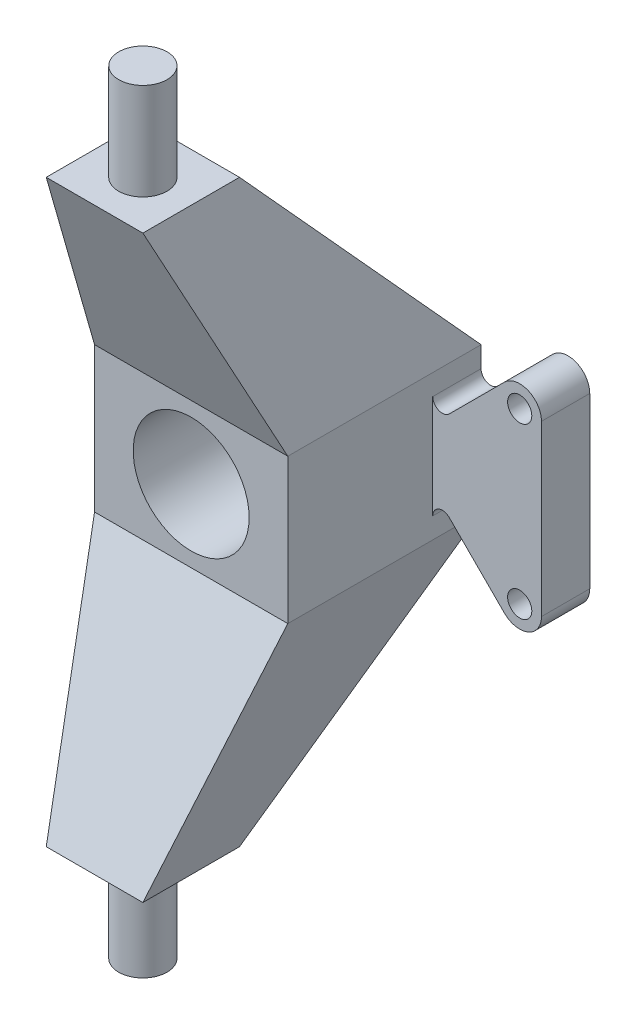
ISO-10303-21;
HEADER;
FILE_DESCRIPTION(('STEP AP214'),'2;1');
FILE_NAME('part.step','',(''),(''),'','','');
FILE_SCHEMA(('AUTOMOTIVE_DESIGN { 1 0 10303 214 1 1 1 1 }'));
ENDSEC;
DATA;
#1=APPLICATION_CONTEXT('core data for automotive mechanical design processes');
#2=APPLICATION_PROTOCOL_DEFINITION('international standard','automotive_design',2000,#1);
#3=PRODUCT_CONTEXT('',#1,'mechanical');
#4=PRODUCT('Part','Part','',(#3));
#5=PRODUCT_RELATED_PRODUCT_CATEGORY('part','',(#4));
#6=PRODUCT_DEFINITION_FORMATION('','',#4);
#7=PRODUCT_DEFINITION_CONTEXT('part definition',#1,'design');
#8=PRODUCT_DEFINITION('design','',#6,#7);
#9=PRODUCT_DEFINITION_SHAPE('','',#8);
#10=(LENGTH_UNIT() NAMED_UNIT(*) SI_UNIT(.MILLI.,.METRE.));
#11=(NAMED_UNIT(*) PLANE_ANGLE_UNIT() SI_UNIT($,.RADIAN.));
#12=(NAMED_UNIT(*) SI_UNIT($,.STERADIAN.) SOLID_ANGLE_UNIT());
#13=UNCERTAINTY_MEASURE_WITH_UNIT(LENGTH_MEASURE(1.E-05),#10,'distance_accuracy_value','');
#14=(GEOMETRIC_REPRESENTATION_CONTEXT(3) GLOBAL_UNCERTAINTY_ASSIGNED_CONTEXT((#13)) GLOBAL_UNIT_ASSIGNED_CONTEXT((#10,
#11,#12)) REPRESENTATION_CONTEXT('',''));
#15=CARTESIAN_POINT('',(0.,0.,0.));
#16=DIRECTION('',(0.,0.,1.));
#17=DIRECTION('',(1.,0.,0.));
#18=AXIS2_PLACEMENT_3D('',#15,#16,#17);
#19=CARTESIAN_POINT('',(-20.,15.,-40.));
#20=DIRECTION('',(-1.,0.,0.));
#21=DIRECTION('',(0.,0.,1.));
#22=AXIS2_PLACEMENT_3D('',#19,#20,#21);
#23=PLANE('',#22);
#24=DIRECTION('',(0.,-1.,0.));
#25=VECTOR('',#24,1.);
#26=CARTESIAN_POINT('',(-20.,15.,0.));
#27=LINE('',#26,#25);
#28=CARTESIAN_POINT('',(-20.,15.,0.));
#29=VERTEX_POINT('',#28);
#30=CARTESIAN_POINT('',(-20.,-15.,0.));
#31=VERTEX_POINT('',#30);
#32=EDGE_CURVE('E443',#29,#31,#27,.T.);
#33=ORIENTED_EDGE('',*,*,#32,.F.);
#34=DIRECTION('',(0.,0.,1.));
#35=VECTOR('',#34,1.);
#36=CARTESIAN_POINT('',(-20.,15.,0.));
#37=LINE('',#36,#35);
#38=CARTESIAN_POINT('',(-20.,15.,-40.));
#39=VERTEX_POINT('',#38);
#40=EDGE_CURVE('E351',#39,#29,#37,.T.);
#41=ORIENTED_EDGE('',*,*,#40,.F.);
#42=DIRECTION('',(0.,-1.,0.));
#43=VECTOR('',#42,1.);
#44=CARTESIAN_POINT('',(-20.,15.,-40.));
#45=LINE('',#44,#43);
#46=CARTESIAN_POINT('',(-20.,-15.,-40.));
#47=VERTEX_POINT('',#46);
#48=EDGE_CURVE('E453',#39,#47,#45,.T.);
#49=ORIENTED_EDGE('',*,*,#48,.T.);
#50=DIRECTION('',(0.,0.,1.));
#51=VECTOR('',#50,1.);
#52=CARTESIAN_POINT('',(-20.,-15.,0.));
#53=LINE('',#52,#51);
#54=EDGE_CURVE('E238',#47,#31,#53,.T.);
#55=ORIENTED_EDGE('',*,*,#54,.T.);
#56=EDGE_LOOP('',(#33,#41,#49,#55));
#57=FACE_BOUND('',#56,.T.);
#58=ADVANCED_FACE('F50',(#57),#23,.T.);
#59=CARTESIAN_POINT('',(20.,15.,-40.));
#60=DIRECTION('',(1.,0.,0.));
#61=DIRECTION('',(0.,0.,-1.));
#62=AXIS2_PLACEMENT_3D('',#59,#60,#61);
#63=PLANE('',#62);
#64=DIRECTION('',(0.,1.,0.));
#65=VECTOR('',#64,1.);
#66=CARTESIAN_POINT('',(20.,15.,-40.));
#67=LINE('',#66,#65);
#68=CARTESIAN_POINT('',(20.,-15.,-40.));
#69=VERTEX_POINT('',#68);
#70=CARTESIAN_POINT('',(20.,-10.6923881554251,-40.));
#71=VERTEX_POINT('',#70);
#72=EDGE_CURVE('E459',#69,#71,#67,.T.);
#73=ORIENTED_EDGE('',*,*,#72,.T.);
#74=DIRECTION('',(0.,0.,-1.));
#75=VECTOR('',#74,1.);
#76=CARTESIAN_POINT('',(20.,-10.6923881554251,-30.));
#77=LINE('',#76,#75);
#78=CARTESIAN_POINT('',(20.,-10.6923881554251,-30.));
#79=VERTEX_POINT('',#78);
#80=EDGE_CURVE('E492',#71,#79,#77,.F.);
#81=ORIENTED_EDGE('',*,*,#80,.T.);
#82=DIRECTION('',(0.,1.,0.));
#83=VECTOR('',#82,1.);
#84=CARTESIAN_POINT('',(20.,5.863961030679,-30.));
#85=LINE('',#84,#83);
#86=CARTESIAN_POINT('',(20.,10.6923881554252,-30.));
#87=VERTEX_POINT('',#86);
#88=EDGE_CURVE('E65',#79,#87,#85,.T.);
#89=ORIENTED_EDGE('',*,*,#88,.T.);
#90=DIRECTION('',(0.,0.,-1.));
#91=VECTOR('',#90,1.);
#92=CARTESIAN_POINT('',(20.,10.6923881554252,-40.));
#93=LINE('',#92,#91);
#94=CARTESIAN_POINT('',(20.,10.6923881554252,-40.));
#95=VERTEX_POINT('',#94);
#96=EDGE_CURVE('E350',#87,#95,#93,.T.);
#97=ORIENTED_EDGE('',*,*,#96,.T.);
#98=CARTESIAN_POINT('',(20.,15.,-40.));
#99=VERTEX_POINT('',#98);
#100=EDGE_CURVE('E457',#95,#99,#67,.T.);
#101=ORIENTED_EDGE('',*,*,#100,.T.);
#102=DIRECTION('',(0.,0.,-1.));
#103=VECTOR('',#102,1.);
#104=CARTESIAN_POINT('',(20.,15.,-40.));
#105=LINE('',#104,#103);
#106=CARTESIAN_POINT('',(20.,15.,0.));
#107=VERTEX_POINT('',#106);
#108=EDGE_CURVE('E471',#99,#107,#105,.F.);
#109=ORIENTED_EDGE('',*,*,#108,.T.);
#110=DIRECTION('',(0.,1.,0.));
#111=VECTOR('',#110,1.);
#112=CARTESIAN_POINT('',(20.,15.,0.));
#113=LINE('',#112,#111);
#114=CARTESIAN_POINT('',(20.,-15.,0.));
#115=VERTEX_POINT('',#114);
#116=EDGE_CURVE('E452',#115,#107,#113,.T.);
#117=ORIENTED_EDGE('',*,*,#116,.F.);
#118=DIRECTION('',(0.,0.,-1.));
#119=VECTOR('',#118,1.);
#120=CARTESIAN_POINT('',(20.,-15.,-40.));
#121=LINE('',#120,#119);
#122=EDGE_CURVE('E336',#69,#115,#121,.F.);
#123=ORIENTED_EDGE('',*,*,#122,.F.);
#124=EDGE_LOOP('',(#73,#81,#89,#97,#101,#109,#117,#123));
#125=FACE_BOUND('',#124,.T.);
#126=ADVANCED_FACE('F568',(#125),#63,.T.);
#127=CARTESIAN_POINT('',(0.,0.,-40.));
#128=DIRECTION('',(0.,0.,1.));
#129=DIRECTION('',(1.,0.,0.));
#130=AXIS2_PLACEMENT_3D('',#127,#128,#129);
#131=PLANE('',#130);
#132=CARTESIAN_POINT('',(0.,0.,-40.));
#133=DIRECTION('',(0.,0.,1.));
#134=DIRECTION('',(1.,0.,0.));
#135=AXIS2_PLACEMENT_3D('',#132,#133,#134);
#136=CIRCLE('',#135,12.);
#137=CARTESIAN_POINT('',(12.,0.,-40.));
#138=VERTEX_POINT('',#137);
#139=EDGE_CURVE('E434',#138,#138,#136,.T.);
#140=ORIENTED_EDGE('',*,*,#139,.T.);
#141=EDGE_LOOP('',(#140));
#142=FACE_BOUND('',#141,.T.);
#143=ORIENTED_EDGE('',*,*,#48,.F.);
#144=DIRECTION('',(1.,0.,0.));
#145=VECTOR('',#144,1.);
#146=CARTESIAN_POINT('',(0.,15.,-40.));
#147=LINE('',#146,#145);
#148=EDGE_CURVE('E462',#99,#39,#147,.F.);
#149=ORIENTED_EDGE('',*,*,#148,.F.);
#150=ORIENTED_EDGE('',*,*,#100,.F.);
#151=CARTESIAN_POINT('',(22.,10.6923881554252,-40.));
#152=DIRECTION('',(0.,0.,1.));
#153=DIRECTION('',(1.,0.,0.));
#154=AXIS2_PLACEMENT_3D('',#151,#152,#153);
#155=CIRCLE('',#154,2.);
#156=CARTESIAN_POINT('',(23.4142135623731,9.27817459305208,-40.));
#157=VERTEX_POINT('',#156);
#158=EDGE_CURVE('E482',#95,#157,#155,.T.);
#159=ORIENTED_EDGE('',*,*,#158,.T.);
#160=DIRECTION('',(0.707106781186549,0.707106781186546,0.));
#161=VECTOR('',#160,1.);
#162=CARTESIAN_POINT('',(20.,5.863961030679,-40.));
#163=LINE('',#162,#161);
#164=CARTESIAN_POINT('',(34.8180194846605,20.6819805153395,-40.));
#165=VERTEX_POINT('',#164);
#166=EDGE_CURVE('E203',#157,#165,#163,.T.);
#167=ORIENTED_EDGE('',*,*,#166,.T.);
#168=CARTESIAN_POINT('',(38.,17.5,-40.));
#169=DIRECTION('',(0.,0.,-1.));
#170=DIRECTION('',(-1.,0.,0.));
#171=AXIS2_PLACEMENT_3D('',#168,#169,#170);
#172=CIRCLE('',#171,4.5);
#173=CARTESIAN_POINT('',(42.5,17.5,-40.));
#174=VERTEX_POINT('',#173);
#175=EDGE_CURVE('E180',#165,#174,#172,.T.);
#176=ORIENTED_EDGE('',*,*,#175,.T.);
#177=DIRECTION('',(0.,-1.,0.));
#178=VECTOR('',#177,1.);
#179=CARTESIAN_POINT('',(42.5,17.5,-40.));
#180=LINE('',#179,#178);
#181=CARTESIAN_POINT('',(42.5,-17.5,-40.));
#182=VERTEX_POINT('',#181);
#183=EDGE_CURVE('E209',#174,#182,#180,.T.);
#184=ORIENTED_EDGE('',*,*,#183,.T.);
#185=CARTESIAN_POINT('',(38.,-17.5,-40.));
#186=DIRECTION('',(0.,0.,-1.));
#187=DIRECTION('',(-1.,0.,0.));
#188=AXIS2_PLACEMENT_3D('',#185,#186,#187);
#189=CIRCLE('',#188,4.49999999999999);
#190=CARTESIAN_POINT('',(34.8180194846605,-20.6819805153395,-40.));
#191=VERTEX_POINT('',#190);
#192=EDGE_CURVE('E213',#182,#191,#189,.T.);
#193=ORIENTED_EDGE('',*,*,#192,.T.);
#194=DIRECTION('',(-0.707106781186549,0.707106781186546,0.));
#195=VECTOR('',#194,1.);
#196=CARTESIAN_POINT('',(34.8180194846605,-20.6819805153395,-40.));
#197=LINE('',#196,#195);
#198=CARTESIAN_POINT('',(23.4142135623731,-9.27817459305205,-40.));
#199=VERTEX_POINT('',#198);
#200=EDGE_CURVE('E217',#191,#199,#197,.T.);
#201=ORIENTED_EDGE('',*,*,#200,.T.);
#202=CARTESIAN_POINT('',(22.,-10.6923881554251,-40.));
#203=DIRECTION('',(0.,0.,1.));
#204=DIRECTION('',(1.,0.,0.));
#205=AXIS2_PLACEMENT_3D('',#202,#203,#204);
#206=CIRCLE('',#205,2.);
#207=EDGE_CURVE('E59',#199,#71,#206,.T.);
#208=ORIENTED_EDGE('',*,*,#207,.T.);
#209=ORIENTED_EDGE('',*,*,#72,.F.);
#210=DIRECTION('',(1.,0.,0.));
#211=VECTOR('',#210,1.);
#212=CARTESIAN_POINT('',(0.,-15.,-40.));
#213=LINE('',#212,#211);
#214=EDGE_CURVE('E331',#69,#47,#213,.F.);
#215=ORIENTED_EDGE('',*,*,#214,.T.);
#216=EDGE_LOOP('',(#143,#149,#150,#159,#167,#176,#184,#193,#201,#208,#209,#215));
#217=FACE_BOUND('',#216,.T.);
#218=CARTESIAN_POINT('',(38.,-17.5,-40.));
#219=DIRECTION('',(0.,0.,-1.));
#220=DIRECTION('',(-1.,0.,0.));
#221=AXIS2_PLACEMENT_3D('',#218,#219,#220);
#222=CIRCLE('',#221,2.5);
#223=CARTESIAN_POINT('',(35.5,-17.5,-40.));
#224=VERTEX_POINT('',#223);
#225=EDGE_CURVE('E931',#224,#224,#222,.T.);
#226=ORIENTED_EDGE('',*,*,#225,.F.);
#227=EDGE_LOOP('',(#226));
#228=FACE_BOUND('',#227,.T.);
#229=CARTESIAN_POINT('',(38.,17.5,-40.));
#230=DIRECTION('',(0.,0.,-1.));
#231=DIRECTION('',(-1.,0.,0.));
#232=AXIS2_PLACEMENT_3D('',#229,#230,#231);
#233=CIRCLE('',#232,2.5);
#234=CARTESIAN_POINT('',(35.5,17.5,-40.));
#235=VERTEX_POINT('',#234);
#236=EDGE_CURVE('E925',#235,#235,#233,.T.);
#237=ORIENTED_EDGE('',*,*,#236,.F.);
#238=EDGE_LOOP('',(#237));
#239=FACE_BOUND('',#238,.T.);
#240=ADVANCED_FACE('F574',(#142,#217,#228,#239),#131,.F.);
#241=CARTESIAN_POINT('',(0.,0.,0.));
#242=DIRECTION('',(0.,0.,1.));
#243=DIRECTION('',(1.,0.,0.));
#244=AXIS2_PLACEMENT_3D('',#241,#242,#243);
#245=PLANE('',#244);
#246=CARTESIAN_POINT('',(0.,0.,0.));
#247=DIRECTION('',(0.,0.,1.));
#248=DIRECTION('',(1.,0.,0.));
#249=AXIS2_PLACEMENT_3D('',#246,#247,#248);
#250=CIRCLE('',#249,12.);
#251=CARTESIAN_POINT('',(12.,0.,0.));
#252=VERTEX_POINT('',#251);
#253=EDGE_CURVE('E444',#252,#252,#250,.T.);
#254=ORIENTED_EDGE('',*,*,#253,.F.);
#255=EDGE_LOOP('',(#254));
#256=FACE_BOUND('',#255,.T.);
#257=ORIENTED_EDGE('',*,*,#32,.T.);
#258=DIRECTION('',(1.,0.,0.));
#259=VECTOR('',#258,1.);
#260=CARTESIAN_POINT('',(0.,-15.,0.));
#261=LINE('',#260,#259);
#262=EDGE_CURVE('E322',#115,#31,#261,.F.);
#263=ORIENTED_EDGE('',*,*,#262,.F.);
#264=ORIENTED_EDGE('',*,*,#116,.T.);
#265=DIRECTION('',(1.,0.,0.));
#266=VECTOR('',#265,1.);
#267=CARTESIAN_POINT('',(0.,15.,0.));
#268=LINE('',#267,#266);
#269=EDGE_CURVE('E458',#107,#29,#268,.F.);
#270=ORIENTED_EDGE('',*,*,#269,.T.);
#271=EDGE_LOOP('',(#257,#263,#264,#270));
#272=FACE_BOUND('',#271,.T.);
#273=ADVANCED_FACE('F604',(#256,#272),#245,.T.);
#274=CARTESIAN_POINT('',(0.,0.,-40.));
#275=DIRECTION('',(0.,0.,1.));
#276=DIRECTION('',(1.,0.,0.));
#277=AXIS2_PLACEMENT_3D('',#274,#275,#276);
#278=CYLINDRICAL_SURFACE('',#277,12.);
#279=ORIENTED_EDGE('',*,*,#139,.F.);
#280=EDGE_LOOP('',(#279));
#281=FACE_BOUND('',#280,.T.);
#282=ORIENTED_EDGE('',*,*,#253,.T.);
#283=EDGE_LOOP('',(#282));
#284=FACE_BOUND('',#283,.T.);
#285=ADVANCED_FACE('F833',(#281,#284),#278,.F.);
#286=CARTESIAN_POINT('',(0.,60.,0.));
#287=DIRECTION('',(0.,-1.,0.));
#288=DIRECTION('',(0.,0.,-1.));
#289=AXIS2_PLACEMENT_3D('',#286,#287,#288);
#290=PLANE('',#289);
#291=CARTESIAN_POINT('',(0.,60.,10.));
#292=DIRECTION('',(0.,1.,0.));
#293=DIRECTION('',(0.,0.,1.));
#294=AXIS2_PLACEMENT_3D('',#291,#292,#293);
#295=CIRCLE('',#294,5.);
#296=CARTESIAN_POINT('',(0.,60.,15.));
#297=VERTEX_POINT('',#296);
#298=EDGE_CURVE('E346',#297,#297,#295,.T.);
#299=ORIENTED_EDGE('',*,*,#298,.F.);
#300=EDGE_LOOP('',(#299));
#301=FACE_BOUND('',#300,.T.);
#302=DIRECTION('',(0.,0.,-1.));
#303=VECTOR('',#302,1.);
#304=CARTESIAN_POINT('',(10.,60.,0.));
#305=LINE('',#304,#303);
#306=CARTESIAN_POINT('',(10.,60.,20.));
#307=VERTEX_POINT('',#306);
#308=CARTESIAN_POINT('',(10.,60.,0.));
#309=VERTEX_POINT('',#308);
#310=EDGE_CURVE('E345',#307,#309,#305,.T.);
#311=ORIENTED_EDGE('',*,*,#310,.T.);
#312=DIRECTION('',(-1.,0.,0.));
#313=VECTOR('',#312,1.);
#314=CARTESIAN_POINT('',(10.,60.,0.));
#315=LINE('',#314,#313);
#316=CARTESIAN_POINT('',(-10.,60.,0.));
#317=VERTEX_POINT('',#316);
#318=EDGE_CURVE('E357',#309,#317,#315,.T.);
#319=ORIENTED_EDGE('',*,*,#318,.T.);
#320=DIRECTION('',(0.,0.,1.));
#321=VECTOR('',#320,1.);
#322=CARTESIAN_POINT('',(-10.,60.,0.));
#323=LINE('',#322,#321);
#324=CARTESIAN_POINT('',(-10.,60.,20.));
#325=VERTEX_POINT('',#324);
#326=EDGE_CURVE('E405',#317,#325,#323,.T.);
#327=ORIENTED_EDGE('',*,*,#326,.T.);
#328=DIRECTION('',(1.,0.,0.));
#329=VECTOR('',#328,1.);
#330=CARTESIAN_POINT('',(10.,60.,20.));
#331=LINE('',#330,#329);
#332=EDGE_CURVE('E423',#325,#307,#331,.T.);
#333=ORIENTED_EDGE('',*,*,#332,.T.);
#334=EDGE_LOOP('',(#311,#319,#327,#333));
#335=FACE_BOUND('',#334,.T.);
#336=ADVANCED_FACE('F376',(#301,#335),#290,.F.);
#337=CARTESIAN_POINT('',(0.,26.4827586206897,-29.7931034482759));
#338=DIRECTION('',(0.,0.66436383882992,-0.74740931868366));
#339=DIRECTION('',(0.,0.74740931868366,0.66436383882992));
#340=AXIS2_PLACEMENT_3D('',#337,#338,#339);
#341=PLANE('',#340);
#342=DIRECTION('',(0.163846384103808,-0.737308728467136,-0.655385536415232));
#343=VECTOR('',#342,1.);
#344=CARTESIAN_POINT('',(10.,60.,0.));
#345=LINE('',#344,#343);
#346=EDGE_CURVE('E363',#309,#99,#345,.T.);
#347=ORIENTED_EDGE('',*,*,#346,.T.);
#348=ORIENTED_EDGE('',*,*,#148,.T.);
#349=DIRECTION('',(-0.163846384103808,-0.737308728467136,-0.655385536415232));
#350=VECTOR('',#349,1.);
#351=CARTESIAN_POINT('',(-10.,60.,0.));
#352=LINE('',#351,#350);
#353=EDGE_CURVE('E503',#317,#39,#352,.T.);
#354=ORIENTED_EDGE('',*,*,#353,.F.);
#355=ORIENTED_EDGE('',*,*,#318,.F.);
#356=EDGE_LOOP('',(#347,#348,#354,#355));
#357=FACE_BOUND('',#356,.T.);
#358=ADVANCED_FACE('F365',(#357),#341,.T.);
#359=CARTESIAN_POINT('',(-22.2352941176471,4.94117647058824,0.));
#360=DIRECTION('',(-0.976187060183953,0.216930457818656,0.));
#361=DIRECTION('',(-0.216930457818656,-0.976187060183953,0.));
#362=AXIS2_PLACEMENT_3D('',#359,#360,#361);
#363=PLANE('',#362);
#364=ORIENTED_EDGE('',*,*,#353,.T.);
#365=ORIENTED_EDGE('',*,*,#40,.T.);
#366=DIRECTION('',(-0.199007438041998,-0.89553347118899,-0.398014876083996));
#367=VECTOR('',#366,1.);
#368=CARTESIAN_POINT('',(-10.,60.,20.));
#369=LINE('',#368,#367);
#370=EDGE_CURVE('E448',#325,#29,#369,.T.);
#371=ORIENTED_EDGE('',*,*,#370,.F.);
#372=ORIENTED_EDGE('',*,*,#326,.F.);
#373=EDGE_LOOP('',(#364,#365,#371,#372));
#374=FACE_BOUND('',#373,.T.);
#375=ADVANCED_FACE('F375',(#374),#363,.T.);
#376=CARTESIAN_POINT('',(22.2352941176471,4.94117647058824,0.));
#377=DIRECTION('',(-0.976187060183953,-0.216930457818656,0.));
#378=DIRECTION('',(0.216930457818656,-0.976187060183953,0.));
#379=AXIS2_PLACEMENT_3D('',#376,#377,#378);
#380=PLANE('',#379);
#381=DIRECTION('',(0.199007438041998,-0.89553347118899,-0.398014876083996));
#382=VECTOR('',#381,1.);
#383=CARTESIAN_POINT('',(10.,60.,20.));
#384=LINE('',#383,#382);
#385=EDGE_CURVE('E499',#307,#107,#384,.T.);
#386=ORIENTED_EDGE('',*,*,#385,.T.);
#387=ORIENTED_EDGE('',*,*,#108,.F.);
#388=ORIENTED_EDGE('',*,*,#346,.F.);
#389=ORIENTED_EDGE('',*,*,#310,.F.);
#390=EDGE_LOOP('',(#386,#387,#388,#389));
#391=FACE_BOUND('',#390,.T.);
#392=ADVANCED_FACE('F382',(#391),#380,.F.);
#393=CARTESIAN_POINT('',(0.,2.47422680412371,-5.56701030927835));
#394=DIRECTION('',(0.,0.406138466053448,-0.913811548620257));
#395=DIRECTION('',(0.,0.913811548620257,0.406138466053448));
#396=AXIS2_PLACEMENT_3D('',#393,#394,#395);
#397=PLANE('',#396);
#398=ORIENTED_EDGE('',*,*,#370,.T.);
#399=ORIENTED_EDGE('',*,*,#269,.F.);
#400=ORIENTED_EDGE('',*,*,#385,.F.);
#401=ORIENTED_EDGE('',*,*,#332,.F.);
#402=EDGE_LOOP('',(#398,#399,#400,#401));
#403=FACE_BOUND('',#402,.T.);
#404=ADVANCED_FACE('F559',(#403),#397,.F.);
#405=CARTESIAN_POINT('',(0.,80.,10.));
#406=DIRECTION('',(0.,-1.,0.));
#407=DIRECTION('',(0.,0.,-1.));
#408=AXIS2_PLACEMENT_3D('',#405,#406,#407);
#409=CYLINDRICAL_SURFACE('',#408,5.);
#410=CARTESIAN_POINT('',(0.,80.,10.));
#411=DIRECTION('',(0.,1.,0.));
#412=DIRECTION('',(0.,0.,1.));
#413=AXIS2_PLACEMENT_3D('',#410,#411,#412);
#414=CIRCLE('',#413,5.);
#415=CARTESIAN_POINT('',(0.,80.,15.));
#416=VERTEX_POINT('',#415);
#417=EDGE_CURVE('E237',#416,#416,#414,.T.);
#418=ORIENTED_EDGE('',*,*,#417,.F.);
#419=EDGE_LOOP('',(#418));
#420=FACE_BOUND('',#419,.T.);
#421=ORIENTED_EDGE('',*,*,#298,.T.);
#422=EDGE_LOOP('',(#421));
#423=FACE_BOUND('',#422,.T.);
#424=ADVANCED_FACE('F556',(#420,#423),#409,.T.);
#425=CARTESIAN_POINT('',(0.,80.,10.));
#426=DIRECTION('',(0.,1.,0.));
#427=DIRECTION('',(0.,0.,1.));
#428=AXIS2_PLACEMENT_3D('',#425,#426,#427);
#429=PLANE('',#428);
#430=ORIENTED_EDGE('',*,*,#417,.T.);
#431=EDGE_LOOP('',(#430));
#432=FACE_BOUND('',#431,.T.);
#433=ADVANCED_FACE('F554',(#432),#429,.T.);
#434=CARTESIAN_POINT('',(0.,-60.,0.));
#435=DIRECTION('',(0.,1.,0.));
#436=DIRECTION('',(0.,0.,-1.));
#437=AXIS2_PLACEMENT_3D('',#434,#435,#436);
#438=PLANE('',#437);
#439=CARTESIAN_POINT('',(0.,-60.,10.));
#440=DIRECTION('',(0.,1.,0.));
#441=DIRECTION('',(0.,0.,1.));
#442=AXIS2_PLACEMENT_3D('',#439,#440,#441);
#443=CIRCLE('',#442,5.);
#444=CARTESIAN_POINT('',(0.,-60.,15.));
#445=VERTEX_POINT('',#444);
#446=EDGE_CURVE('E233',#445,#445,#443,.T.);
#447=ORIENTED_EDGE('',*,*,#446,.T.);
#448=EDGE_LOOP('',(#447));
#449=FACE_BOUND('',#448,.T.);
#450=CARTESIAN_POINT('',(10.,-60.,20.));
#451=DIRECTION('',(0.,0.,-1.));
#452=VECTOR('',#451,1.);
#453=LINE('',#450,#452);
#454=CARTESIAN_POINT('',(10.,-60.,20.));
#455=VERTEX_POINT('',#454);
#456=CARTESIAN_POINT('',(10.,-60.,0.));
#457=VERTEX_POINT('',#456);
#458=EDGE_CURVE('E232',#455,#457,#453,.T.);
#459=ORIENTED_EDGE('',*,*,#458,.F.);
#460=CARTESIAN_POINT('',(-10.,-60.,20.));
#461=DIRECTION('',(1.,0.,0.));
#462=VECTOR('',#461,1.);
#463=LINE('',#460,#462);
#464=CARTESIAN_POINT('',(-10.,-60.,20.));
#465=VERTEX_POINT('',#464);
#466=EDGE_CURVE('E309',#465,#455,#463,.T.);
#467=ORIENTED_EDGE('',*,*,#466,.F.);
#468=CARTESIAN_POINT('',(-10.,-60.,0.));
#469=DIRECTION('',(0.,0.,1.));
#470=VECTOR('',#469,1.);
#471=LINE('',#468,#470);
#472=CARTESIAN_POINT('',(-10.,-60.,0.));
#473=VERTEX_POINT('',#472);
#474=EDGE_CURVE('E298',#473,#465,#471,.T.);
#475=ORIENTED_EDGE('',*,*,#474,.F.);
#476=CARTESIAN_POINT('',(10.,-60.,0.));
#477=DIRECTION('',(-1.,0.,0.));
#478=VECTOR('',#477,1.);
#479=LINE('',#476,#478);
#480=EDGE_CURVE('E243',#457,#473,#479,.T.);
#481=ORIENTED_EDGE('',*,*,#480,.F.);
#482=EDGE_LOOP('',(#459,#467,#475,#481));
#483=FACE_BOUND('',#482,.T.);
#484=ADVANCED_FACE('F262',(#449,#483),#438,.F.);
#485=CARTESIAN_POINT('',(0.,-26.4827586206897,-29.7931034482759));
#486=DIRECTION('',(0.,-0.66436383882992,-0.74740931868366));
#487=DIRECTION('',(0.,-0.74740931868366,0.66436383882992));
#488=AXIS2_PLACEMENT_3D('',#485,#486,#487);
#489=PLANE('',#488);
#490=DIRECTION('',(0.163846384103808,0.737308728467136,-0.655385536415232));
#491=VECTOR('',#490,1.);
#492=CARTESIAN_POINT('',(10.,-60.,0.));
#493=LINE('',#492,#491);
#494=EDGE_CURVE('E249',#457,#69,#493,.T.);
#495=ORIENTED_EDGE('',*,*,#494,.F.);
#496=ORIENTED_EDGE('',*,*,#480,.T.);
#497=DIRECTION('',(-0.163846384103808,0.737308728467136,-0.655385536415232));
#498=VECTOR('',#497,1.);
#499=CARTESIAN_POINT('',(-10.,-60.,0.));
#500=LINE('',#499,#498);
#501=EDGE_CURVE('E516',#473,#47,#500,.T.);
#502=ORIENTED_EDGE('',*,*,#501,.T.);
#503=ORIENTED_EDGE('',*,*,#214,.F.);
#504=EDGE_LOOP('',(#495,#496,#502,#503));
#505=FACE_BOUND('',#504,.T.);
#506=ADVANCED_FACE('F251',(#505),#489,.T.);
#507=CARTESIAN_POINT('',(-22.2352941176471,-4.94117647058824,0.));
#508=DIRECTION('',(-0.976187060183953,-0.216930457818656,0.));
#509=DIRECTION('',(-0.216930457818656,0.976187060183953,0.));
#510=AXIS2_PLACEMENT_3D('',#507,#508,#509);
#511=PLANE('',#510);
#512=ORIENTED_EDGE('',*,*,#501,.F.);
#513=ORIENTED_EDGE('',*,*,#474,.T.);
#514=DIRECTION('',(-0.199007438041998,0.89553347118899,-0.398014876083996));
#515=VECTOR('',#514,1.);
#516=CARTESIAN_POINT('',(-10.,-60.,20.));
#517=LINE('',#516,#515);
#518=EDGE_CURVE('E332',#465,#31,#517,.T.);
#519=ORIENTED_EDGE('',*,*,#518,.T.);
#520=ORIENTED_EDGE('',*,*,#54,.F.);
#521=EDGE_LOOP('',(#512,#513,#519,#520));
#522=FACE_BOUND('',#521,.T.);
#523=ADVANCED_FACE('F261',(#522),#511,.T.);
#524=CARTESIAN_POINT('',(22.2352941176471,-4.94117647058824,0.));
#525=DIRECTION('',(-0.976187060183953,0.216930457818656,0.));
#526=DIRECTION('',(0.216930457818656,0.976187060183953,0.));
#527=AXIS2_PLACEMENT_3D('',#524,#525,#526);
#528=PLANE('',#527);
#529=DIRECTION('',(0.199007438041998,0.89553347118899,-0.398014876083996));
#530=VECTOR('',#529,1.);
#531=CARTESIAN_POINT('',(10.,-60.,20.));
#532=LINE('',#531,#530);
#533=EDGE_CURVE('E512',#455,#115,#532,.T.);
#534=ORIENTED_EDGE('',*,*,#533,.F.);
#535=ORIENTED_EDGE('',*,*,#458,.T.);
#536=ORIENTED_EDGE('',*,*,#494,.T.);
#537=ORIENTED_EDGE('',*,*,#122,.T.);
#538=EDGE_LOOP('',(#534,#535,#536,#537));
#539=FACE_BOUND('',#538,.T.);
#540=ADVANCED_FACE('F268',(#539),#528,.F.);
#541=CARTESIAN_POINT('',(0.,-2.47422680412371,-5.56701030927835));
#542=DIRECTION('',(0.,-0.406138466053448,-0.913811548620257));
#543=DIRECTION('',(0.,-0.913811548620257,0.406138466053448));
#544=AXIS2_PLACEMENT_3D('',#541,#542,#543);
#545=PLANE('',#544);
#546=ORIENTED_EDGE('',*,*,#518,.F.);
#547=ORIENTED_EDGE('',*,*,#466,.T.);
#548=ORIENTED_EDGE('',*,*,#533,.T.);
#549=ORIENTED_EDGE('',*,*,#262,.T.);
#550=EDGE_LOOP('',(#546,#547,#548,#549));
#551=FACE_BOUND('',#550,.T.);
#552=ADVANCED_FACE('F544',(#551),#545,.F.);
#553=CARTESIAN_POINT('',(0.,-80.,10.));
#554=DIRECTION('',(0.,1.,0.));
#555=DIRECTION('',(0.,0.,-1.));
#556=AXIS2_PLACEMENT_3D('',#553,#554,#555);
#557=CYLINDRICAL_SURFACE('',#556,5.);
#558=CARTESIAN_POINT('',(0.,-80.,10.));
#559=DIRECTION('',(0.,1.,0.));
#560=DIRECTION('',(0.,0.,1.));
#561=AXIS2_PLACEMENT_3D('',#558,#559,#560);
#562=CIRCLE('',#561,5.);
#563=CARTESIAN_POINT('',(0.,-80.,15.));
#564=VERTEX_POINT('',#563);
#565=EDGE_CURVE('E223',#564,#564,#562,.T.);
#566=ORIENTED_EDGE('',*,*,#565,.T.);
#567=EDGE_LOOP('',(#566));
#568=FACE_BOUND('',#567,.T.);
#569=ORIENTED_EDGE('',*,*,#446,.F.);
#570=EDGE_LOOP('',(#569));
#571=FACE_BOUND('',#570,.T.);
#572=ADVANCED_FACE('F553',(#568,#571),#557,.T.);
#573=CARTESIAN_POINT('',(0.,-80.,10.));
#574=DIRECTION('',(0.,-1.,0.));
#575=DIRECTION('',(0.,0.,1.));
#576=AXIS2_PLACEMENT_3D('',#573,#574,#575);
#577=PLANE('',#576);
#578=ORIENTED_EDGE('',*,*,#565,.F.);
#579=EDGE_LOOP('',(#578));
#580=FACE_BOUND('',#579,.T.);
#581=ADVANCED_FACE('F633',(#580),#577,.T.);
#582=CARTESIAN_POINT('',(34.8180194846605,-20.6819805153395,-30.));
#583=DIRECTION('',(-0.707106781186546,-0.707106781186549,0.));
#584=DIRECTION('',(0.707106781186549,-0.707106781186546,0.));
#585=AXIS2_PLACEMENT_3D('',#582,#583,#584);
#586=PLANE('',#585);
#587=DIRECTION('',(-0.707106781186549,0.707106781186546,0.));
#588=VECTOR('',#587,1.);
#589=CARTESIAN_POINT('',(34.8180194846605,-20.6819805153395,-30.));
#590=LINE('',#589,#588);
#591=CARTESIAN_POINT('',(34.8180194846605,-20.6819805153395,-30.));
#592=VERTEX_POINT('',#591);
#593=CARTESIAN_POINT('',(23.4142135623731,-9.27817459305205,-30.));
#594=VERTEX_POINT('',#593);
#595=EDGE_CURVE('E183',#592,#594,#590,.T.);
#596=ORIENTED_EDGE('',*,*,#595,.T.);
#597=DIRECTION('',(0.,0.,-1.));
#598=VECTOR('',#597,1.);
#599=CARTESIAN_POINT('',(23.4142135623731,-9.27817459305205,-40.));
#600=LINE('',#599,#598);
#601=EDGE_CURVE('E488',#594,#199,#600,.T.);
#602=ORIENTED_EDGE('',*,*,#601,.T.);
#603=ORIENTED_EDGE('',*,*,#200,.F.);
#604=DIRECTION('',(0.,0.,-1.));
#605=VECTOR('',#604,1.);
#606=CARTESIAN_POINT('',(34.8180194846605,-20.6819805153395,-30.));
#607=LINE('',#606,#605);
#608=EDGE_CURVE('E220',#592,#191,#607,.T.);
#609=ORIENTED_EDGE('',*,*,#608,.F.);
#610=EDGE_LOOP('',(#596,#602,#603,#609));
#611=FACE_BOUND('',#610,.T.);
#612=ADVANCED_FACE('F613',(#611),#586,.T.);
#613=CARTESIAN_POINT('',(38.,-17.5,-30.));
#614=DIRECTION('',(0.,0.,-1.));
#615=DIRECTION('',(-1.,0.,0.));
#616=AXIS2_PLACEMENT_3D('',#613,#614,#615);
#617=CYLINDRICAL_SURFACE('',#616,4.49999999999999);
#618=ORIENTED_EDGE('',*,*,#192,.F.);
#619=DIRECTION('',(0.,0.,-1.));
#620=VECTOR('',#619,1.);
#621=CARTESIAN_POINT('',(42.5,-17.5,-30.));
#622=LINE('',#621,#620);
#623=CARTESIAN_POINT('',(42.5,-17.5,-30.));
#624=VERTEX_POINT('',#623);
#625=EDGE_CURVE('E224',#624,#182,#622,.T.);
#626=ORIENTED_EDGE('',*,*,#625,.F.);
#627=CARTESIAN_POINT('',(38.,-17.5,-30.));
#628=DIRECTION('',(0.,0.,-1.));
#629=DIRECTION('',(-1.,0.,0.));
#630=AXIS2_PLACEMENT_3D('',#627,#628,#629);
#631=CIRCLE('',#630,4.49999999999999);
#632=EDGE_CURVE('E193',#624,#592,#631,.T.);
#633=ORIENTED_EDGE('',*,*,#632,.T.);
#634=ORIENTED_EDGE('',*,*,#608,.T.);
#635=EDGE_LOOP('',(#618,#626,#633,#634));
#636=FACE_BOUND('',#635,.T.);
#637=ADVANCED_FACE('F617',(#636),#617,.T.);
#638=CARTESIAN_POINT('',(42.5,17.5,-30.));
#639=DIRECTION('',(1.,0.,0.));
#640=DIRECTION('',(0.,0.,-1.));
#641=AXIS2_PLACEMENT_3D('',#638,#639,#640);
#642=PLANE('',#641);
#643=ORIENTED_EDGE('',*,*,#183,.F.);
#644=DIRECTION('',(0.,0.,-1.));
#645=VECTOR('',#644,1.);
#646=CARTESIAN_POINT('',(42.5,17.5,-30.));
#647=LINE('',#646,#645);
#648=CARTESIAN_POINT('',(42.5,17.5,-30.));
#649=VERTEX_POINT('',#648);
#650=EDGE_CURVE('E182',#649,#174,#647,.T.);
#651=ORIENTED_EDGE('',*,*,#650,.F.);
#652=DIRECTION('',(0.,-1.,0.));
#653=VECTOR('',#652,1.);
#654=CARTESIAN_POINT('',(42.5,17.5,-30.));
#655=LINE('',#654,#653);
#656=EDGE_CURVE('E189',#649,#624,#655,.T.);
#657=ORIENTED_EDGE('',*,*,#656,.T.);
#658=ORIENTED_EDGE('',*,*,#625,.T.);
#659=EDGE_LOOP('',(#643,#651,#657,#658));
#660=FACE_BOUND('',#659,.T.);
#661=ADVANCED_FACE('F620',(#660),#642,.T.);
#662=CARTESIAN_POINT('',(38.,17.5,-30.));
#663=DIRECTION('',(0.,0.,-1.));
#664=DIRECTION('',(-1.,0.,0.));
#665=AXIS2_PLACEMENT_3D('',#662,#663,#664);
#666=CYLINDRICAL_SURFACE('',#665,4.5);
#667=ORIENTED_EDGE('',*,*,#175,.F.);
#668=DIRECTION('',(0.,0.,-1.));
#669=VECTOR('',#668,1.);
#670=CARTESIAN_POINT('',(34.8180194846605,20.6819805153395,-30.));
#671=LINE('',#670,#669);
#672=CARTESIAN_POINT('',(34.8180194846605,20.6819805153395,-30.));
#673=VERTEX_POINT('',#672);
#674=EDGE_CURVE('E167',#673,#165,#671,.T.);
#675=ORIENTED_EDGE('',*,*,#674,.F.);
#676=CARTESIAN_POINT('',(38.,17.5,-30.));
#677=DIRECTION('',(0.,0.,-1.));
#678=DIRECTION('',(-1.,0.,0.));
#679=AXIS2_PLACEMENT_3D('',#676,#677,#678);
#680=CIRCLE('',#679,4.5);
#681=EDGE_CURVE('E174',#673,#649,#680,.T.);
#682=ORIENTED_EDGE('',*,*,#681,.T.);
#683=ORIENTED_EDGE('',*,*,#650,.T.);
#684=EDGE_LOOP('',(#667,#675,#682,#683));
#685=FACE_BOUND('',#684,.T.);
#686=ADVANCED_FACE('F178',(#685),#666,.T.);
#687=CARTESIAN_POINT('',(20.,5.863961030679,-30.));
#688=DIRECTION('',(-0.707106781186546,0.707106781186549,0.));
#689=DIRECTION('',(-0.707106781186549,-0.707106781186546,0.));
#690=AXIS2_PLACEMENT_3D('',#687,#688,#689);
#691=PLANE('',#690);
#692=ORIENTED_EDGE('',*,*,#166,.F.);
#693=DIRECTION('',(0.,0.,-1.));
#694=VECTOR('',#693,1.);
#695=CARTESIAN_POINT('',(23.4142135623731,9.27817459305208,-30.));
#696=LINE('',#695,#694);
#697=CARTESIAN_POINT('',(23.4142135623731,9.27817459305208,-30.));
#698=VERTEX_POINT('',#697);
#699=EDGE_CURVE('E170',#157,#698,#696,.F.);
#700=ORIENTED_EDGE('',*,*,#699,.T.);
#701=DIRECTION('',(0.707106781186549,0.707106781186546,0.));
#702=VECTOR('',#701,1.);
#703=CARTESIAN_POINT('',(20.,5.863961030679,-30.));
#704=LINE('',#703,#702);
#705=EDGE_CURVE('E163',#698,#673,#704,.T.);
#706=ORIENTED_EDGE('',*,*,#705,.T.);
#707=ORIENTED_EDGE('',*,*,#674,.T.);
#708=EDGE_LOOP('',(#692,#700,#706,#707));
#709=FACE_BOUND('',#708,.T.);
#710=ADVANCED_FACE('F166',(#709),#691,.T.);
#711=CARTESIAN_POINT('',(38.,-17.5,-30.));
#712=DIRECTION('',(0.,0.,-1.));
#713=DIRECTION('',(-1.,0.,0.));
#714=AXIS2_PLACEMENT_3D('',#711,#712,#713);
#715=PLANE('',#714);
#716=CARTESIAN_POINT('',(38.,-17.5,-30.));
#717=DIRECTION('',(0.,0.,-1.));
#718=DIRECTION('',(-1.,0.,0.));
#719=AXIS2_PLACEMENT_3D('',#716,#717,#718);
#720=CIRCLE('',#719,2.5);
#721=CARTESIAN_POINT('',(35.5,-17.5,-30.));
#722=VERTEX_POINT('',#721);
#723=EDGE_CURVE('E921',#722,#722,#720,.T.);
#724=ORIENTED_EDGE('',*,*,#723,.T.);
#725=EDGE_LOOP('',(#724));
#726=FACE_BOUND('',#725,.T.);
#727=CARTESIAN_POINT('',(38.,17.5,-30.));
#728=DIRECTION('',(0.,0.,-1.));
#729=DIRECTION('',(-1.,0.,0.));
#730=AXIS2_PLACEMENT_3D('',#727,#728,#729);
#731=CIRCLE('',#730,2.5);
#732=CARTESIAN_POINT('',(35.5,17.5,-30.));
#733=VERTEX_POINT('',#732);
#734=EDGE_CURVE('E206',#733,#733,#731,.T.);
#735=ORIENTED_EDGE('',*,*,#734,.T.);
#736=EDGE_LOOP('',(#735));
#737=FACE_BOUND('',#736,.T.);
#738=ORIENTED_EDGE('',*,*,#88,.F.);
#739=CARTESIAN_POINT('',(22.,-10.6923881554251,-30.));
#740=DIRECTION('',(0.,0.,-1.));
#741=DIRECTION('',(-1.,0.,0.));
#742=AXIS2_PLACEMENT_3D('',#739,#740,#741);
#743=CIRCLE('',#742,2.);
#744=EDGE_CURVE('E12',#79,#594,#743,.T.);
#745=ORIENTED_EDGE('',*,*,#744,.T.);
#746=ORIENTED_EDGE('',*,*,#595,.F.);
#747=ORIENTED_EDGE('',*,*,#632,.F.);
#748=ORIENTED_EDGE('',*,*,#656,.F.);
#749=ORIENTED_EDGE('',*,*,#681,.F.);
#750=ORIENTED_EDGE('',*,*,#705,.F.);
#751=CARTESIAN_POINT('',(22.,10.6923881554252,-30.));
#752=DIRECTION('',(0.,0.,-1.));
#753=DIRECTION('',(-1.,0.,0.));
#754=AXIS2_PLACEMENT_3D('',#751,#752,#753);
#755=CIRCLE('',#754,2.);
#756=EDGE_CURVE('E485',#698,#87,#755,.T.);
#757=ORIENTED_EDGE('',*,*,#756,.T.);
#758=EDGE_LOOP('',(#738,#745,#746,#747,#748,#749,#750,#757));
#759=FACE_BOUND('',#758,.T.);
#760=ADVANCED_FACE('F186',(#726,#737,#759),#715,.F.);
#761=CARTESIAN_POINT('',(38.,17.5,-30.));
#762=DIRECTION('',(0.,0.,-1.));
#763=DIRECTION('',(-1.,0.,0.));
#764=AXIS2_PLACEMENT_3D('',#761,#762,#763);
#765=CYLINDRICAL_SURFACE('',#764,2.5);
#766=ORIENTED_EDGE('',*,*,#734,.F.);
#767=EDGE_LOOP('',(#766));
#768=FACE_BOUND('',#767,.T.);
#769=ORIENTED_EDGE('',*,*,#236,.T.);
#770=EDGE_LOOP('',(#769));
#771=FACE_BOUND('',#770,.T.);
#772=ADVANCED_FACE('F588',(#768,#771),#765,.F.);
#773=CARTESIAN_POINT('',(38.,-17.5,-30.));
#774=DIRECTION('',(0.,0.,-1.));
#775=DIRECTION('',(-1.,0.,0.));
#776=AXIS2_PLACEMENT_3D('',#773,#774,#775);
#777=CYLINDRICAL_SURFACE('',#776,2.5);
#778=ORIENTED_EDGE('',*,*,#723,.F.);
#779=EDGE_LOOP('',(#778));
#780=FACE_BOUND('',#779,.T.);
#781=ORIENTED_EDGE('',*,*,#225,.T.);
#782=EDGE_LOOP('',(#781));
#783=FACE_BOUND('',#782,.T.);
#784=ADVANCED_FACE('F581',(#780,#783),#777,.F.);
#785=CARTESIAN_POINT('',(22.,10.6923881554252,-40.));
#786=DIRECTION('',(0.,0.,1.));
#787=DIRECTION('',(1.,0.,0.));
#788=AXIS2_PLACEMENT_3D('',#785,#786,#787);
#789=CYLINDRICAL_SURFACE('',#788,2.);
#790=ORIENTED_EDGE('',*,*,#756,.F.);
#791=ORIENTED_EDGE('',*,*,#699,.F.);
#792=ORIENTED_EDGE('',*,*,#158,.F.);
#793=ORIENTED_EDGE('',*,*,#96,.F.);
#794=EDGE_LOOP('',(#790,#791,#792,#793));
#795=FACE_BOUND('',#794,.T.);
#796=ADVANCED_FACE('F579',(#795),#789,.F.);
#797=CARTESIAN_POINT('',(22.,-10.6923881554251,-30.));
#798=DIRECTION('',(0.,0.,1.));
#799=DIRECTION('',(1.,0.,0.));
#800=AXIS2_PLACEMENT_3D('',#797,#798,#799);
#801=CYLINDRICAL_SURFACE('',#800,2.);
#802=ORIENTED_EDGE('',*,*,#744,.F.);
#803=ORIENTED_EDGE('',*,*,#80,.F.);
#804=ORIENTED_EDGE('',*,*,#207,.F.);
#805=ORIENTED_EDGE('',*,*,#601,.F.);
#806=EDGE_LOOP('',(#802,#803,#804,#805));
#807=FACE_BOUND('',#806,.T.);
#808=ADVANCED_FACE('F52',(#807),#801,.F.);
#809=CLOSED_SHELL('',(#58,#126,#240,#273,#285,#336,#358,#375,#392,#404,#424,#433,#484,#506,#523,
#540,#552,#572,#581,#612,#637,#661,#686,#710,#760,#772,#784,#796,#808));
#810=MANIFOLD_SOLID_BREP('B2',#809);
#811=ADVANCED_BREP_SHAPE_REPRESENTATION('',(#18,#810),#14);
#812=SHAPE_DEFINITION_REPRESENTATION(#9,#811);
ENDSEC;
END-ISO-10303-21;
